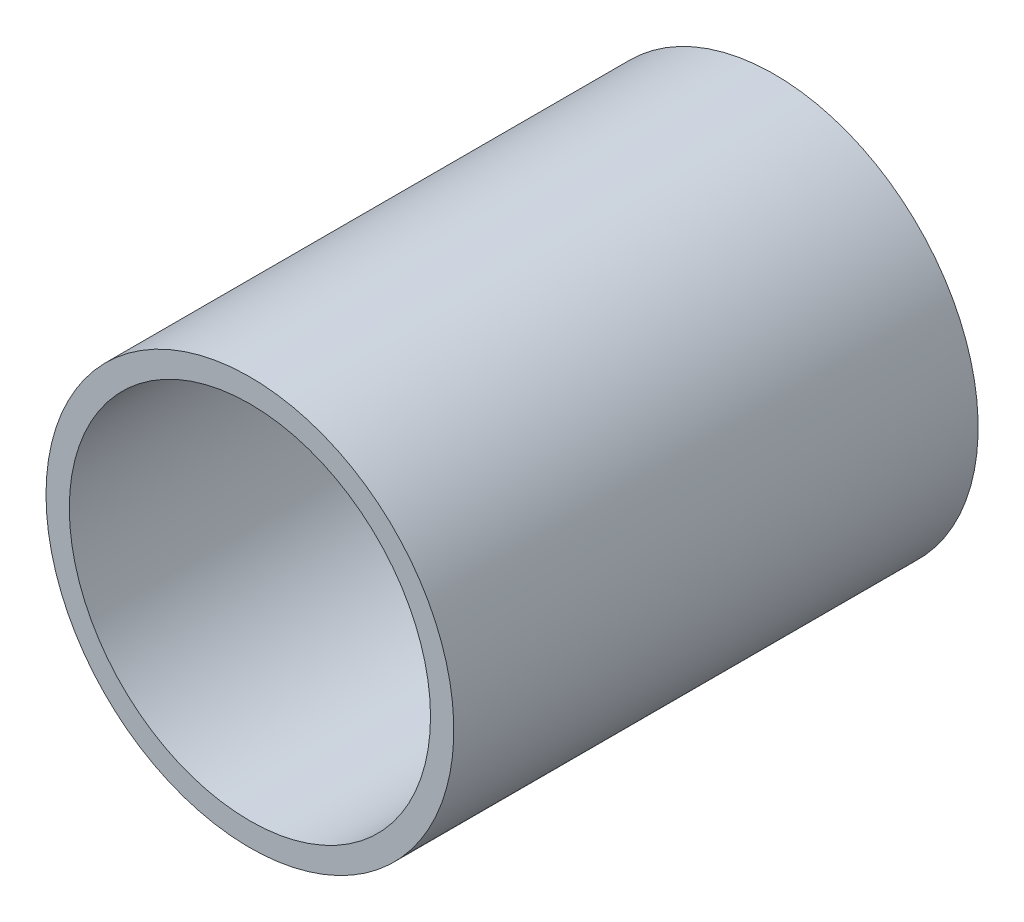
ISO-10303-21;
HEADER;
FILE_DESCRIPTION(('STEP AP214'),'2;1');
FILE_NAME('part.step','',(''),(''),'','','');
FILE_SCHEMA(('AUTOMOTIVE_DESIGN { 1 0 10303 214 1 1 1 1 }'));
ENDSEC;
DATA;
#1=APPLICATION_CONTEXT('core data for automotive mechanical design processes');
#2=APPLICATION_PROTOCOL_DEFINITION('international standard','automotive_design',2000,#1);
#3=PRODUCT_CONTEXT('',#1,'mechanical');
#4=PRODUCT('Part','Part','',(#3));
#5=PRODUCT_RELATED_PRODUCT_CATEGORY('part','',(#4));
#6=PRODUCT_DEFINITION_FORMATION('','',#4);
#7=PRODUCT_DEFINITION_CONTEXT('part definition',#1,'design');
#8=PRODUCT_DEFINITION('design','',#6,#7);
#9=PRODUCT_DEFINITION_SHAPE('','',#8);
#10=(LENGTH_UNIT() NAMED_UNIT(*) SI_UNIT(.MILLI.,.METRE.));
#11=(NAMED_UNIT(*) PLANE_ANGLE_UNIT() SI_UNIT($,.RADIAN.));
#12=(NAMED_UNIT(*) SI_UNIT($,.STERADIAN.) SOLID_ANGLE_UNIT());
#13=UNCERTAINTY_MEASURE_WITH_UNIT(LENGTH_MEASURE(1.E-05),#10,'distance_accuracy_value','');
#14=(GEOMETRIC_REPRESENTATION_CONTEXT(3) GLOBAL_UNCERTAINTY_ASSIGNED_CONTEXT((#13)) GLOBAL_UNIT_ASSIGNED_CONTEXT((#10,
#11,#12)) REPRESENTATION_CONTEXT('',''));
#15=CARTESIAN_POINT('',(0.,0.,0.));
#16=DIRECTION('',(0.,0.,1.));
#17=DIRECTION('',(1.,0.,0.));
#18=AXIS2_PLACEMENT_3D('',#15,#16,#17);
#19=CARTESIAN_POINT('',(0.,0.,90.));
#20=DIRECTION('',(0.,0.,1.));
#21=DIRECTION('',(1.,0.,0.));
#22=AXIS2_PLACEMENT_3D('',#19,#20,#21);
#23=PLANE('',#22);
#24=CARTESIAN_POINT('',(0.,0.,90.));
#25=DIRECTION('',(0.,0.,1.));
#26=DIRECTION('',(1.,0.,0.));
#27=AXIS2_PLACEMENT_3D('',#24,#25,#26);
#28=CIRCLE('',#27,35.);
#29=CARTESIAN_POINT('',(-35.,0.,90.));
#30=VERTEX_POINT('',#29);
#31=EDGE_CURVE('E10',#30,#30,#28,.T.);
#32=ORIENTED_EDGE('',*,*,#31,.T.);
#33=EDGE_LOOP('',(#32));
#34=FACE_BOUND('',#33,.T.);
#35=CARTESIAN_POINT('',(0.,0.,90.));
#36=DIRECTION('',(0.,0.,1.));
#37=DIRECTION('',(1.,0.,0.));
#38=AXIS2_PLACEMENT_3D('',#35,#36,#37);
#39=CIRCLE('',#38,31.);
#40=CARTESIAN_POINT('',(-31.,0.,90.));
#41=VERTEX_POINT('',#40);
#42=EDGE_CURVE('E43',#41,#41,#39,.T.);
#43=ORIENTED_EDGE('',*,*,#42,.F.);
#44=EDGE_LOOP('',(#43));
#45=FACE_BOUND('',#44,.T.);
#46=ADVANCED_FACE('F32',(#34,#45),#23,.T.);
#47=CARTESIAN_POINT('',(0.,0.,0.));
#48=DIRECTION('',(0.,0.,1.));
#49=DIRECTION('',(1.,0.,0.));
#50=AXIS2_PLACEMENT_3D('',#47,#48,#49);
#51=PLANE('',#50);
#52=CARTESIAN_POINT('',(0.,0.,0.));
#53=DIRECTION('',(0.,0.,1.));
#54=DIRECTION('',(1.,0.,0.));
#55=AXIS2_PLACEMENT_3D('',#52,#53,#54);
#56=CIRCLE('',#55,35.);
#57=CARTESIAN_POINT('',(-35.,0.,0.));
#58=VERTEX_POINT('',#57);
#59=EDGE_CURVE('E36',#58,#58,#56,.T.);
#60=ORIENTED_EDGE('',*,*,#59,.F.);
#61=EDGE_LOOP('',(#60));
#62=FACE_BOUND('',#61,.T.);
#63=CARTESIAN_POINT('',(0.,0.,0.));
#64=DIRECTION('',(0.,0.,1.));
#65=DIRECTION('',(1.,0.,0.));
#66=AXIS2_PLACEMENT_3D('',#63,#64,#65);
#67=CIRCLE('',#66,31.);
#68=CARTESIAN_POINT('',(-31.,0.,0.));
#69=VERTEX_POINT('',#68);
#70=EDGE_CURVE('E45',#69,#69,#67,.T.);
#71=ORIENTED_EDGE('',*,*,#70,.T.);
#72=EDGE_LOOP('',(#71));
#73=FACE_BOUND('',#72,.T.);
#74=ADVANCED_FACE('F55',(#62,#73),#51,.F.);
#75=CARTESIAN_POINT('',(0.,0.,90.));
#76=DIRECTION('',(0.,0.,-1.));
#77=DIRECTION('',(-1.,0.,0.));
#78=AXIS2_PLACEMENT_3D('',#75,#76,#77);
#79=CYLINDRICAL_SURFACE('',#78,35.);
#80=CARTESIAN_POINT('',(-35.,0.,90.));
#81=CARTESIAN_POINT('',(-35.,0.,89.0625));
#82=CARTESIAN_POINT('',(-35.,0.,88.125));
#83=CARTESIAN_POINT('',(-35.,0.,86.25));
#84=CARTESIAN_POINT('',(-35.,0.,85.3125));
#85=CARTESIAN_POINT('',(-35.,0.,83.4375));
#86=CARTESIAN_POINT('',(-35.,0.,82.5));
#87=CARTESIAN_POINT('',(-35.,0.,80.625));
#88=CARTESIAN_POINT('',(-35.,0.,79.6875));
#89=CARTESIAN_POINT('',(-35.,0.,77.8125));
#90=CARTESIAN_POINT('',(-35.,0.,76.875));
#91=CARTESIAN_POINT('',(-35.,0.,75.));
#92=CARTESIAN_POINT('',(-35.,0.,74.0625));
#93=CARTESIAN_POINT('',(-35.,0.,72.1875));
#94=CARTESIAN_POINT('',(-35.,0.,71.25));
#95=CARTESIAN_POINT('',(-35.,0.,69.375));
#96=CARTESIAN_POINT('',(-35.,0.,68.4375));
#97=CARTESIAN_POINT('',(-35.,0.,66.5625));
#98=CARTESIAN_POINT('',(-35.,0.,65.625));
#99=CARTESIAN_POINT('',(-35.,0.,63.75));
#100=CARTESIAN_POINT('',(-35.,0.,62.8125));
#101=CARTESIAN_POINT('',(-35.,0.,60.9375));
#102=CARTESIAN_POINT('',(-35.,0.,60.));
#103=CARTESIAN_POINT('',(-35.,0.,58.125));
#104=CARTESIAN_POINT('',(-35.,0.,57.1875));
#105=CARTESIAN_POINT('',(-35.,0.,55.3125));
#106=CARTESIAN_POINT('',(-35.,0.,54.375));
#107=CARTESIAN_POINT('',(-35.,0.,52.5));
#108=CARTESIAN_POINT('',(-35.,0.,51.5625));
#109=CARTESIAN_POINT('',(-35.,0.,49.6875));
#110=CARTESIAN_POINT('',(-35.,0.,48.75));
#111=CARTESIAN_POINT('',(-35.,0.,46.875));
#112=CARTESIAN_POINT('',(-35.,0.,45.9375));
#113=CARTESIAN_POINT('',(-35.,0.,44.0625));
#114=CARTESIAN_POINT('',(-35.,0.,43.125));
#115=CARTESIAN_POINT('',(-35.,0.,41.25));
#116=CARTESIAN_POINT('',(-35.,0.,40.3125));
#117=CARTESIAN_POINT('',(-35.,0.,38.4375));
#118=CARTESIAN_POINT('',(-35.,0.,37.5));
#119=CARTESIAN_POINT('',(-35.,0.,35.625));
#120=CARTESIAN_POINT('',(-35.,0.,34.6875));
#121=CARTESIAN_POINT('',(-35.,0.,32.8125));
#122=CARTESIAN_POINT('',(-35.,0.,31.875));
#123=CARTESIAN_POINT('',(-35.,0.,30.));
#124=CARTESIAN_POINT('',(-35.,0.,29.0625));
#125=CARTESIAN_POINT('',(-35.,0.,27.1875));
#126=CARTESIAN_POINT('',(-35.,0.,26.25));
#127=CARTESIAN_POINT('',(-35.,0.,24.375));
#128=CARTESIAN_POINT('',(-35.,0.,23.4375));
#129=CARTESIAN_POINT('',(-35.,0.,21.5625));
#130=CARTESIAN_POINT('',(-35.,0.,20.625));
#131=CARTESIAN_POINT('',(-35.,0.,18.75));
#132=CARTESIAN_POINT('',(-35.,0.,17.8125));
#133=CARTESIAN_POINT('',(-35.,0.,15.9375));
#134=CARTESIAN_POINT('',(-35.,0.,15.));
#135=CARTESIAN_POINT('',(-35.,0.,13.125));
#136=CARTESIAN_POINT('',(-35.,0.,12.1875));
#137=CARTESIAN_POINT('',(-35.,0.,10.3125));
#138=CARTESIAN_POINT('',(-35.,0.,9.37499999999999));
#139=CARTESIAN_POINT('',(-35.,0.,7.49999999999999));
#140=CARTESIAN_POINT('',(-35.,0.,6.56249999999999));
#141=CARTESIAN_POINT('',(-35.,0.,4.68749999999999));
#142=CARTESIAN_POINT('',(-35.,0.,3.74999999999998));
#143=CARTESIAN_POINT('',(-35.,0.,1.87499999999998));
#144=CARTESIAN_POINT('',(-35.,0.,0.937499999999986));
#145=CARTESIAN_POINT('',(-35.,0.,0.));
#146=B_SPLINE_CURVE_WITH_KNOTS('',3,(#80,#81,#82,#83,#84,#85,#86,#87,#88,#89,#90,#91,#92,#93,
#94,#95,#96,#97,#98,#99,#100,#101,#102,#103,#104,#105,#106,#107,#108,#109,#110,#111,#112,#113,
#114,#115,#116,#117,#118,#119,#120,#121,#122,#123,#124,#125,#126,#127,#128,#129,#130,#131,#132,
#133,#134,#135,#136,#137,#138,#139,#140,#141,#142,#143,#144,#145),.UNSPECIFIED.,.F.,.F.,(4,2,2,
2,2,2,2,2,2,2,2,2,2,2,2,2,2,2,2,2,2,2,2,2,2,2,2,2,2,2,2,2,4),(0.,2.8125,5.62499999999999,
8.43749999999999,11.25,14.0625,16.875,19.6875,22.5,25.3125,28.125,30.9375,33.75,36.5625,39.375,
42.1875,45.,47.8125,50.625,53.4375,56.25,59.0625,61.875,64.6875,67.5,70.3125,73.125,75.9375,
78.75,81.5625,84.375,87.1875,90.),.UNSPECIFIED.);
#147=EDGE_CURVE('BSEAM34',#30,#58,#146,.T.);
#148=ORIENTED_EDGE('',*,*,#31,.F.);
#149=ORIENTED_EDGE('',*,*,#59,.T.);
#150=ORIENTED_EDGE('',*,*,#147,.T.);
#151=ORIENTED_EDGE('',*,*,#147,.F.);
#152=EDGE_LOOP('',(#148,#150,#149,#151));
#153=FACE_BOUND('',#152,.T.);
#154=ADVANCED_FACE('F34',(#153),#79,.T.);
#155=CARTESIAN_POINT('',(0.,0.,90.));
#156=DIRECTION('',(0.,0.,-1.));
#157=DIRECTION('',(-1.,0.,0.));
#158=AXIS2_PLACEMENT_3D('',#155,#156,#157);
#159=CYLINDRICAL_SURFACE('',#158,31.);
#160=CARTESIAN_POINT('',(-31.,0.,90.));
#161=CARTESIAN_POINT('',(-31.,0.,89.0625));
#162=CARTESIAN_POINT('',(-31.,0.,88.125));
#163=CARTESIAN_POINT('',(-31.,0.,86.25));
#164=CARTESIAN_POINT('',(-31.,0.,85.3125));
#165=CARTESIAN_POINT('',(-31.,0.,83.4375));
#166=CARTESIAN_POINT('',(-31.,0.,82.5));
#167=CARTESIAN_POINT('',(-31.,0.,80.625));
#168=CARTESIAN_POINT('',(-31.,0.,79.6875));
#169=CARTESIAN_POINT('',(-31.,0.,77.8125));
#170=CARTESIAN_POINT('',(-31.,0.,76.875));
#171=CARTESIAN_POINT('',(-31.,0.,75.));
#172=CARTESIAN_POINT('',(-31.,0.,74.0625));
#173=CARTESIAN_POINT('',(-31.,0.,72.1875));
#174=CARTESIAN_POINT('',(-31.,0.,71.25));
#175=CARTESIAN_POINT('',(-31.,0.,69.375));
#176=CARTESIAN_POINT('',(-31.,0.,68.4375));
#177=CARTESIAN_POINT('',(-31.,0.,66.5625));
#178=CARTESIAN_POINT('',(-31.,0.,65.625));
#179=CARTESIAN_POINT('',(-31.,0.,63.75));
#180=CARTESIAN_POINT('',(-31.,0.,62.8125));
#181=CARTESIAN_POINT('',(-31.,0.,60.9375));
#182=CARTESIAN_POINT('',(-31.,0.,60.));
#183=CARTESIAN_POINT('',(-31.,0.,58.125));
#184=CARTESIAN_POINT('',(-31.,0.,57.1875));
#185=CARTESIAN_POINT('',(-31.,0.,55.3125));
#186=CARTESIAN_POINT('',(-31.,0.,54.375));
#187=CARTESIAN_POINT('',(-31.,0.,52.5));
#188=CARTESIAN_POINT('',(-31.,0.,51.5625));
#189=CARTESIAN_POINT('',(-31.,0.,49.6875));
#190=CARTESIAN_POINT('',(-31.,0.,48.75));
#191=CARTESIAN_POINT('',(-31.,0.,46.875));
#192=CARTESIAN_POINT('',(-31.,0.,45.9375));
#193=CARTESIAN_POINT('',(-31.,0.,44.0625));
#194=CARTESIAN_POINT('',(-31.,0.,43.125));
#195=CARTESIAN_POINT('',(-31.,0.,41.25));
#196=CARTESIAN_POINT('',(-31.,0.,40.3125));
#197=CARTESIAN_POINT('',(-31.,0.,38.4375));
#198=CARTESIAN_POINT('',(-31.,0.,37.5));
#199=CARTESIAN_POINT('',(-31.,0.,35.625));
#200=CARTESIAN_POINT('',(-31.,0.,34.6875));
#201=CARTESIAN_POINT('',(-31.,0.,32.8125));
#202=CARTESIAN_POINT('',(-31.,0.,31.875));
#203=CARTESIAN_POINT('',(-31.,0.,30.));
#204=CARTESIAN_POINT('',(-31.,0.,29.0625));
#205=CARTESIAN_POINT('',(-31.,0.,27.1875));
#206=CARTESIAN_POINT('',(-31.,0.,26.25));
#207=CARTESIAN_POINT('',(-31.,0.,24.375));
#208=CARTESIAN_POINT('',(-31.,0.,23.4375));
#209=CARTESIAN_POINT('',(-31.,0.,21.5625));
#210=CARTESIAN_POINT('',(-31.,0.,20.625));
#211=CARTESIAN_POINT('',(-31.,0.,18.75));
#212=CARTESIAN_POINT('',(-31.,0.,17.8125));
#213=CARTESIAN_POINT('',(-31.,0.,15.9375));
#214=CARTESIAN_POINT('',(-31.,0.,15.));
#215=CARTESIAN_POINT('',(-31.,0.,13.125));
#216=CARTESIAN_POINT('',(-31.,0.,12.1875));
#217=CARTESIAN_POINT('',(-31.,0.,10.3125));
#218=CARTESIAN_POINT('',(-31.,0.,9.37499999999999));
#219=CARTESIAN_POINT('',(-31.,0.,7.49999999999999));
#220=CARTESIAN_POINT('',(-31.,0.,6.56249999999999));
#221=CARTESIAN_POINT('',(-31.,0.,4.68749999999999));
#222=CARTESIAN_POINT('',(-31.,0.,3.74999999999998));
#223=CARTESIAN_POINT('',(-31.,0.,1.87499999999998));
#224=CARTESIAN_POINT('',(-31.,0.,0.937499999999986));
#225=CARTESIAN_POINT('',(-31.,0.,0.));
#226=B_SPLINE_CURVE_WITH_KNOTS('',3,(#160,#161,#162,#163,#164,#165,#166,#167,#168,#169,#170,
#171,#172,#173,#174,#175,#176,#177,#178,#179,#180,#181,#182,#183,#184,#185,#186,#187,#188,#189,
#190,#191,#192,#193,#194,#195,#196,#197,#198,#199,#200,#201,#202,#203,#204,#205,#206,#207,#208,
#209,#210,#211,#212,#213,#214,#215,#216,#217,#218,#219,#220,#221,#222,#223,#224,#225),
.UNSPECIFIED.,.F.,.F.,(4,2,2,2,2,2,2,2,2,2,2,2,2,2,2,2,2,2,2,2,2,2,2,2,2,2,2,2,2,2,2,2,4),(0.,
2.8125,5.62499999999999,8.43749999999999,11.25,14.0625,16.875,19.6875,22.5,25.3125,28.125,
30.9375,33.75,36.5625,39.375,42.1875,45.,47.8125,50.625,53.4375,56.25,59.0625,61.875,64.6875,
67.5,70.3125,73.125,75.9375,78.75,81.5625,84.375,87.1875,90.),.UNSPECIFIED.);
#227=EDGE_CURVE('BSEAM51',#41,#69,#226,.T.);
#228=ORIENTED_EDGE('',*,*,#42,.T.);
#229=ORIENTED_EDGE('',*,*,#70,.F.);
#230=ORIENTED_EDGE('',*,*,#227,.T.);
#231=ORIENTED_EDGE('',*,*,#227,.F.);
#232=EDGE_LOOP('',(#228,#230,#229,#231));
#233=FACE_BOUND('',#232,.T.);
#234=ADVANCED_FACE('F51',(#233),#159,.F.);
#235=CLOSED_SHELL('',(#46,#74,#154,#234));
#236=MANIFOLD_SOLID_BREP('B2',#235);
#237=ADVANCED_BREP_SHAPE_REPRESENTATION('',(#18,#236),#14);
#238=SHAPE_DEFINITION_REPRESENTATION(#9,#237);
ENDSEC;
END-ISO-10303-21;
